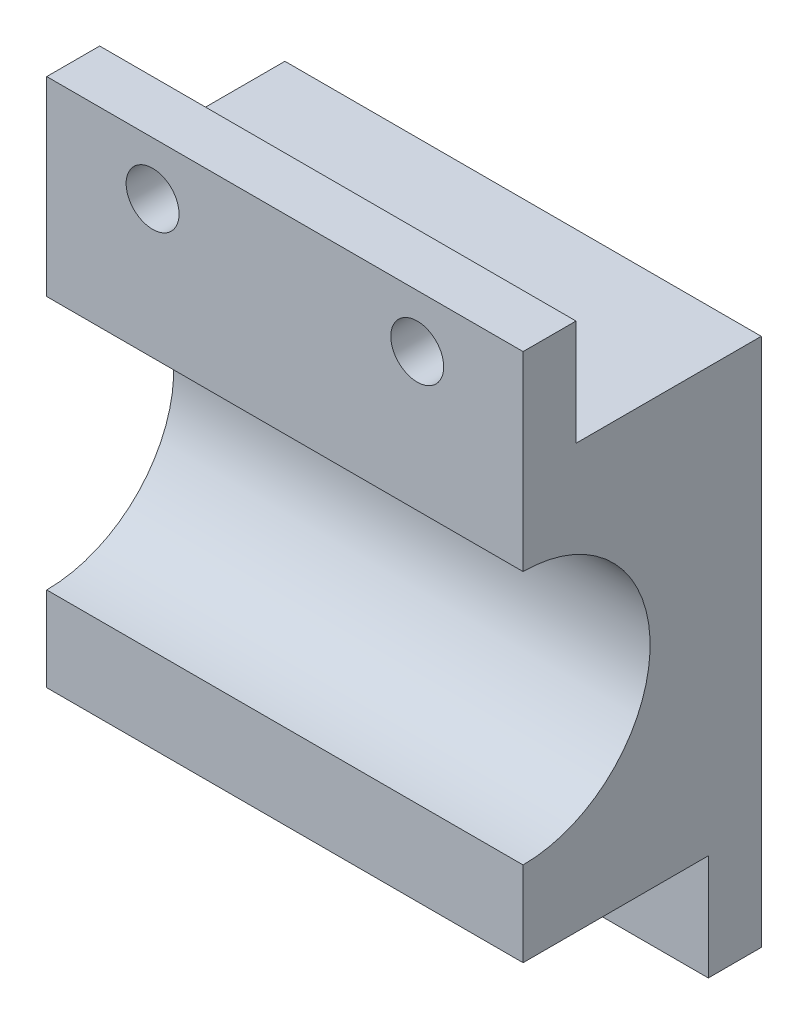
ISO-10303-21;
HEADER;
FILE_DESCRIPTION(('STEP AP214'),'2;1');
FILE_NAME('part.step','',(''),(''),'','','');
FILE_SCHEMA(('AUTOMOTIVE_DESIGN { 1 0 10303 214 1 1 1 1 }'));
ENDSEC;
DATA;
#1=APPLICATION_CONTEXT('core data for automotive mechanical design processes');
#2=APPLICATION_PROTOCOL_DEFINITION('international standard','automotive_design',2000,#1);
#3=PRODUCT_CONTEXT('',#1,'mechanical');
#4=PRODUCT('Part','Part','',(#3));
#5=PRODUCT_RELATED_PRODUCT_CATEGORY('part','',(#4));
#6=PRODUCT_DEFINITION_FORMATION('','',#4);
#7=PRODUCT_DEFINITION_CONTEXT('part definition',#1,'design');
#8=PRODUCT_DEFINITION('design','',#6,#7);
#9=PRODUCT_DEFINITION_SHAPE('','',#8);
#10=(LENGTH_UNIT() NAMED_UNIT(*) SI_UNIT(.MILLI.,.METRE.));
#11=(NAMED_UNIT(*) PLANE_ANGLE_UNIT() SI_UNIT($,.RADIAN.));
#12=(NAMED_UNIT(*) SI_UNIT($,.STERADIAN.) SOLID_ANGLE_UNIT());
#13=UNCERTAINTY_MEASURE_WITH_UNIT(LENGTH_MEASURE(1.E-05),#10,'distance_accuracy_value','');
#14=(GEOMETRIC_REPRESENTATION_CONTEXT(3) GLOBAL_UNCERTAINTY_ASSIGNED_CONTEXT((#13)) GLOBAL_UNIT_ASSIGNED_CONTEXT((#10,
#11,#12)) REPRESENTATION_CONTEXT('',''));
#15=CARTESIAN_POINT('',(0.,0.,0.));
#16=DIRECTION('',(0.,0.,1.));
#17=DIRECTION('',(1.,0.,0.));
#18=AXIS2_PLACEMENT_3D('',#15,#16,#17);
#19=CARTESIAN_POINT('',(45.,-18.,0.));
#20=DIRECTION('',(0.,0.,-1.));
#21=DIRECTION('',(-1.,0.,0.));
#22=AXIS2_PLACEMENT_3D('',#19,#20,#21);
#23=PLANE('',#22);
#24=CARTESIAN_POINT('',(35.,-5.,0.));
#25=DIRECTION('',(0.,0.,-1.));
#26=DIRECTION('',(0.,-1.,0.));
#27=AXIS2_PLACEMENT_3D('',#24,#25,#26);
#28=CIRCLE('',#27,2.5);
#29=CARTESIAN_POINT('',(35.,-2.5,0.));
#30=VERTEX_POINT('',#29);
#31=EDGE_CURVE('E194',#30,#30,#28,.T.);
#32=ORIENTED_EDGE('',*,*,#31,.T.);
#33=EDGE_LOOP('',(#32));
#34=FACE_BOUND('',#33,.T.);
#35=CARTESIAN_POINT('',(10.,-4.99999999999999,0.));
#36=DIRECTION('',(0.,0.,-1.));
#37=DIRECTION('',(0.,1.,0.));
#38=AXIS2_PLACEMENT_3D('',#35,#36,#37);
#39=CIRCLE('',#38,2.5);
#40=CARTESIAN_POINT('',(10.,-2.49999999999999,0.));
#41=VERTEX_POINT('',#40);
#42=EDGE_CURVE('E183',#41,#41,#39,.T.);
#43=ORIENTED_EDGE('',*,*,#42,.T.);
#44=EDGE_LOOP('',(#43));
#45=FACE_BOUND('',#44,.T.);
#46=DIRECTION('',(0.,-1.,0.));
#47=VECTOR('',#46,1.);
#48=CARTESIAN_POINT('',(0.,-18.,0.));
#49=LINE('',#48,#47);
#50=CARTESIAN_POINT('',(0.,0.,0.));
#51=VERTEX_POINT('',#50);
#52=CARTESIAN_POINT('',(0.,-18.,0.));
#53=VERTEX_POINT('',#52);
#54=EDGE_CURVE('E145',#51,#53,#49,.T.);
#55=ORIENTED_EDGE('',*,*,#54,.T.);
#56=DIRECTION('',(-1.,0.,0.));
#57=VECTOR('',#56,1.);
#58=CARTESIAN_POINT('',(45.,-18.,0.));
#59=LINE('',#58,#57);
#60=CARTESIAN_POINT('',(45.,-18.,0.));
#61=VERTEX_POINT('',#60);
#62=EDGE_CURVE('E11',#61,#53,#59,.T.);
#63=ORIENTED_EDGE('',*,*,#62,.F.);
#64=DIRECTION('',(0.,-1.,0.));
#65=VECTOR('',#64,1.);
#66=CARTESIAN_POINT('',(45.,-18.,0.));
#67=LINE('',#66,#65);
#68=CARTESIAN_POINT('',(45.,0.,0.));
#69=VERTEX_POINT('',#68);
#70=EDGE_CURVE('E164',#69,#61,#67,.T.);
#71=ORIENTED_EDGE('',*,*,#70,.F.);
#72=DIRECTION('',(-1.,0.,0.));
#73=VECTOR('',#72,1.);
#74=CARTESIAN_POINT('',(45.,0.,0.));
#75=LINE('',#74,#73);
#76=EDGE_CURVE('E141',#69,#51,#75,.T.);
#77=ORIENTED_EDGE('',*,*,#76,.T.);
#78=EDGE_LOOP('',(#55,#63,#71,#77));
#79=FACE_BOUND('',#78,.T.);
#80=ADVANCED_FACE('F35',(#34,#45,#79),#23,.F.);
#81=CARTESIAN_POINT('',(45.,-30.,0.));
#82=DIRECTION('',(-1.,0.,0.));
#83=DIRECTION('',(0.,0.,1.));
#84=AXIS2_PLACEMENT_3D('',#81,#82,#83);
#85=CYLINDRICAL_SURFACE('',#84,12.);
#86=CARTESIAN_POINT('',(0.,-30.,0.));
#87=DIRECTION('',(-1.,0.,0.));
#88=DIRECTION('',(0.,0.,-1.));
#89=AXIS2_PLACEMENT_3D('',#86,#87,#88);
#90=CIRCLE('',#89,12.);
#91=CARTESIAN_POINT('',(0.,-42.,0.));
#92=VERTEX_POINT('',#91);
#93=EDGE_CURVE('E148',#53,#92,#90,.T.);
#94=ORIENTED_EDGE('',*,*,#93,.T.);
#95=DIRECTION('',(-1.,0.,0.));
#96=VECTOR('',#95,1.);
#97=CARTESIAN_POINT('',(45.,-42.,0.));
#98=LINE('',#97,#96);
#99=CARTESIAN_POINT('',(45.,-42.,0.));
#100=VERTEX_POINT('',#99);
#101=EDGE_CURVE('E44',#100,#92,#98,.T.);
#102=ORIENTED_EDGE('',*,*,#101,.F.);
#103=CARTESIAN_POINT('',(45.,-30.,0.));
#104=DIRECTION('',(-1.,0.,0.));
#105=DIRECTION('',(0.,0.,-1.));
#106=AXIS2_PLACEMENT_3D('',#103,#104,#105);
#107=CIRCLE('',#106,12.);
#108=EDGE_CURVE('E102',#61,#100,#107,.T.);
#109=ORIENTED_EDGE('',*,*,#108,.F.);
#110=ORIENTED_EDGE('',*,*,#62,.T.);
#111=EDGE_LOOP('',(#94,#102,#109,#110));
#112=FACE_BOUND('',#111,.T.);
#113=ADVANCED_FACE('F243',(#112),#85,.F.);
#114=CARTESIAN_POINT('',(45.,-50.,0.));
#115=DIRECTION('',(0.,0.,-1.));
#116=DIRECTION('',(-1.,0.,0.));
#117=AXIS2_PLACEMENT_3D('',#114,#115,#116);
#118=PLANE('',#117);
#119=DIRECTION('',(0.,-1.,0.));
#120=VECTOR('',#119,1.);
#121=CARTESIAN_POINT('',(0.,-50.,0.));
#122=LINE('',#121,#120);
#123=CARTESIAN_POINT('',(0.,-50.,0.));
#124=VERTEX_POINT('',#123);
#125=EDGE_CURVE('E151',#92,#124,#122,.T.);
#126=ORIENTED_EDGE('',*,*,#125,.T.);
#127=DIRECTION('',(-1.,0.,0.));
#128=VECTOR('',#127,1.);
#129=CARTESIAN_POINT('',(45.,-50.,0.));
#130=LINE('',#129,#128);
#131=CARTESIAN_POINT('',(45.,-50.,0.));
#132=VERTEX_POINT('',#131);
#133=EDGE_CURVE('E177',#132,#124,#130,.T.);
#134=ORIENTED_EDGE('',*,*,#133,.F.);
#135=DIRECTION('',(0.,-1.,0.));
#136=VECTOR('',#135,1.);
#137=CARTESIAN_POINT('',(45.,-50.,0.));
#138=LINE('',#137,#136);
#139=EDGE_CURVE('E207',#100,#132,#138,.T.);
#140=ORIENTED_EDGE('',*,*,#139,.F.);
#141=ORIENTED_EDGE('',*,*,#101,.T.);
#142=EDGE_LOOP('',(#126,#134,#140,#141));
#143=FACE_BOUND('',#142,.T.);
#144=ADVANCED_FACE('F248',(#143),#118,.F.);
#145=CARTESIAN_POINT('',(45.,-50.,-17.5));
#146=DIRECTION('',(0.,1.,0.));
#147=DIRECTION('',(0.,0.,1.));
#148=AXIS2_PLACEMENT_3D('',#145,#146,#147);
#149=PLANE('',#148);
#150=DIRECTION('',(0.,0.,-1.));
#151=VECTOR('',#150,1.);
#152=CARTESIAN_POINT('',(0.,-50.,-17.5));
#153=LINE('',#152,#151);
#154=CARTESIAN_POINT('',(0.,-50.,-17.5));
#155=VERTEX_POINT('',#154);
#156=EDGE_CURVE('E153',#124,#155,#153,.T.);
#157=ORIENTED_EDGE('',*,*,#156,.T.);
#158=DIRECTION('',(-1.,0.,0.));
#159=VECTOR('',#158,1.);
#160=CARTESIAN_POINT('',(45.,-50.,-17.5));
#161=LINE('',#160,#159);
#162=CARTESIAN_POINT('',(45.,-50.,-17.5));
#163=VERTEX_POINT('',#162);
#164=EDGE_CURVE('E174',#163,#155,#161,.T.);
#165=ORIENTED_EDGE('',*,*,#164,.F.);
#166=DIRECTION('',(0.,0.,-1.));
#167=VECTOR('',#166,1.);
#168=CARTESIAN_POINT('',(45.,-50.,-17.5));
#169=LINE('',#168,#167);
#170=EDGE_CURVE('E209',#132,#163,#169,.T.);
#171=ORIENTED_EDGE('',*,*,#170,.F.);
#172=ORIENTED_EDGE('',*,*,#133,.T.);
#173=EDGE_LOOP('',(#157,#165,#171,#172));
#174=FACE_BOUND('',#173,.T.);
#175=ADVANCED_FACE('F345',(#174),#149,.F.);
#176=CARTESIAN_POINT('',(45.,-60.,-17.5));
#177=DIRECTION('',(0.,0.,-1.));
#178=DIRECTION('',(0.,1.,0.));
#179=AXIS2_PLACEMENT_3D('',#176,#177,#178);
#180=PLANE('',#179);
#181=CARTESIAN_POINT('',(10.,-55.,-17.5));
#182=DIRECTION('',(0.,0.,-1.));
#183=DIRECTION('',(0.,1.,0.));
#184=AXIS2_PLACEMENT_3D('',#181,#182,#183);
#185=CIRCLE('',#184,2.5);
#186=CARTESIAN_POINT('',(10.,-52.5,-17.5));
#187=VERTEX_POINT('',#186);
#188=EDGE_CURVE('E187',#187,#187,#185,.T.);
#189=ORIENTED_EDGE('',*,*,#188,.T.);
#190=EDGE_LOOP('',(#189));
#191=FACE_BOUND('',#190,.T.);
#192=CARTESIAN_POINT('',(35.,-55.,-17.5));
#193=DIRECTION('',(0.,0.,-1.));
#194=DIRECTION('',(0.,1.,0.));
#195=AXIS2_PLACEMENT_3D('',#192,#193,#194);
#196=CIRCLE('',#195,2.5);
#197=CARTESIAN_POINT('',(35.,-52.5,-17.5));
#198=VERTEX_POINT('',#197);
#199=EDGE_CURVE('E149',#198,#198,#196,.T.);
#200=ORIENTED_EDGE('',*,*,#199,.T.);
#201=EDGE_LOOP('',(#200));
#202=FACE_BOUND('',#201,.T.);
#203=DIRECTION('',(0.,-1.,0.));
#204=VECTOR('',#203,1.);
#205=CARTESIAN_POINT('',(0.,-60.,-17.5));
#206=LINE('',#205,#204);
#207=CARTESIAN_POINT('',(0.,-60.,-17.5));
#208=VERTEX_POINT('',#207);
#209=EDGE_CURVE('E155',#155,#208,#206,.T.);
#210=ORIENTED_EDGE('',*,*,#209,.T.);
#211=DIRECTION('',(-1.,0.,0.));
#212=VECTOR('',#211,1.);
#213=CARTESIAN_POINT('',(45.,-60.,-17.5));
#214=LINE('',#213,#212);
#215=CARTESIAN_POINT('',(45.,-60.,-17.5));
#216=VERTEX_POINT('',#215);
#217=EDGE_CURVE('E171',#216,#208,#214,.T.);
#218=ORIENTED_EDGE('',*,*,#217,.F.);
#219=DIRECTION('',(0.,-1.,0.));
#220=VECTOR('',#219,1.);
#221=CARTESIAN_POINT('',(45.,-60.,-17.5));
#222=LINE('',#221,#220);
#223=EDGE_CURVE('E211',#163,#216,#222,.T.);
#224=ORIENTED_EDGE('',*,*,#223,.F.);
#225=ORIENTED_EDGE('',*,*,#164,.T.);
#226=EDGE_LOOP('',(#210,#218,#224,#225));
#227=FACE_BOUND('',#226,.T.);
#228=ADVANCED_FACE('F337',(#191,#202,#227),#180,.F.);
#229=CARTESIAN_POINT('',(45.,-60.,-22.5));
#230=DIRECTION('',(0.,1.,0.));
#231=DIRECTION('',(0.,0.,1.));
#232=AXIS2_PLACEMENT_3D('',#229,#230,#231);
#233=PLANE('',#232);
#234=DIRECTION('',(0.,0.,-1.));
#235=VECTOR('',#234,1.);
#236=CARTESIAN_POINT('',(0.,-60.,-22.5));
#237=LINE('',#236,#235);
#238=CARTESIAN_POINT('',(0.,-60.,-22.5));
#239=VERTEX_POINT('',#238);
#240=EDGE_CURVE('E157',#208,#239,#237,.T.);
#241=ORIENTED_EDGE('',*,*,#240,.T.);
#242=DIRECTION('',(-1.,0.,0.));
#243=VECTOR('',#242,1.);
#244=CARTESIAN_POINT('',(45.,-60.,-22.5));
#245=LINE('',#244,#243);
#246=CARTESIAN_POINT('',(45.,-60.,-22.5));
#247=VERTEX_POINT('',#246);
#248=EDGE_CURVE('E168',#247,#239,#245,.T.);
#249=ORIENTED_EDGE('',*,*,#248,.F.);
#250=DIRECTION('',(0.,0.,-1.));
#251=VECTOR('',#250,1.);
#252=CARTESIAN_POINT('',(45.,-60.,-22.5));
#253=LINE('',#252,#251);
#254=EDGE_CURVE('E213',#216,#247,#253,.T.);
#255=ORIENTED_EDGE('',*,*,#254,.F.);
#256=ORIENTED_EDGE('',*,*,#217,.T.);
#257=EDGE_LOOP('',(#241,#249,#255,#256));
#258=FACE_BOUND('',#257,.T.);
#259=ADVANCED_FACE('F219',(#258),#233,.F.);
#260=CARTESIAN_POINT('',(45.,-10.,-22.5));
#261=DIRECTION('',(0.,0.,1.));
#262=DIRECTION('',(0.,-1.,0.));
#263=AXIS2_PLACEMENT_3D('',#260,#261,#262);
#264=PLANE('',#263);
#265=CARTESIAN_POINT('',(10.,-55.,-22.5));
#266=DIRECTION('',(0.,0.,-1.));
#267=DIRECTION('',(0.,1.,0.));
#268=AXIS2_PLACEMENT_3D('',#265,#266,#267);
#269=CIRCLE('',#268,2.5);
#270=CARTESIAN_POINT('',(10.,-52.5,-22.5));
#271=VERTEX_POINT('',#270);
#272=EDGE_CURVE('E189',#271,#271,#269,.T.);
#273=ORIENTED_EDGE('',*,*,#272,.F.);
#274=EDGE_LOOP('',(#273));
#275=FACE_BOUND('',#274,.T.);
#276=CARTESIAN_POINT('',(35.,-55.,-22.5));
#277=DIRECTION('',(0.,0.,-1.));
#278=DIRECTION('',(0.,-1.,0.));
#279=AXIS2_PLACEMENT_3D('',#276,#277,#278);
#280=CIRCLE('',#279,2.5);
#281=CARTESIAN_POINT('',(35.,-52.5,-22.5));
#282=VERTEX_POINT('',#281);
#283=EDGE_CURVE('E200',#282,#282,#280,.T.);
#284=ORIENTED_EDGE('',*,*,#283,.F.);
#285=EDGE_LOOP('',(#284));
#286=FACE_BOUND('',#285,.T.);
#287=DIRECTION('',(0.,1.,0.));
#288=VECTOR('',#287,1.);
#289=CARTESIAN_POINT('',(0.,-10.,-22.5));
#290=LINE('',#289,#288);
#291=CARTESIAN_POINT('',(0.,-10.,-22.5));
#292=VERTEX_POINT('',#291);
#293=EDGE_CURVE('E159',#239,#292,#290,.T.);
#294=ORIENTED_EDGE('',*,*,#293,.T.);
#295=DIRECTION('',(-1.,0.,0.));
#296=VECTOR('',#295,1.);
#297=CARTESIAN_POINT('',(45.,-10.,-22.5));
#298=LINE('',#297,#296);
#299=CARTESIAN_POINT('',(45.,-10.,-22.5));
#300=VERTEX_POINT('',#299);
#301=EDGE_CURVE('E136',#300,#292,#298,.T.);
#302=ORIENTED_EDGE('',*,*,#301,.F.);
#303=DIRECTION('',(0.,1.,0.));
#304=VECTOR('',#303,1.);
#305=CARTESIAN_POINT('',(45.,-10.,-22.5));
#306=LINE('',#305,#304);
#307=EDGE_CURVE('E127',#247,#300,#306,.T.);
#308=ORIENTED_EDGE('',*,*,#307,.F.);
#309=ORIENTED_EDGE('',*,*,#248,.T.);
#310=EDGE_LOOP('',(#294,#302,#308,#309));
#311=FACE_BOUND('',#310,.T.);
#312=ADVANCED_FACE('F223',(#275,#286,#311),#264,.F.);
#313=CARTESIAN_POINT('',(45.,-10.,-5.));
#314=DIRECTION('',(0.,-1.,0.));
#315=DIRECTION('',(0.,0.,-1.));
#316=AXIS2_PLACEMENT_3D('',#313,#314,#315);
#317=PLANE('',#316);
#318=DIRECTION('',(0.,0.,1.));
#319=VECTOR('',#318,1.);
#320=CARTESIAN_POINT('',(0.,-10.,-5.));
#321=LINE('',#320,#319);
#322=CARTESIAN_POINT('',(0.,-10.,-5.));
#323=VERTEX_POINT('',#322);
#324=EDGE_CURVE('E135',#292,#323,#321,.T.);
#325=ORIENTED_EDGE('',*,*,#324,.T.);
#326=DIRECTION('',(-1.,0.,0.));
#327=VECTOR('',#326,1.);
#328=CARTESIAN_POINT('',(45.,-10.,-5.));
#329=LINE('',#328,#327);
#330=CARTESIAN_POINT('',(45.,-10.,-5.));
#331=VERTEX_POINT('',#330);
#332=EDGE_CURVE('E132',#331,#323,#329,.T.);
#333=ORIENTED_EDGE('',*,*,#332,.F.);
#334=DIRECTION('',(0.,0.,1.));
#335=VECTOR('',#334,1.);
#336=CARTESIAN_POINT('',(45.,-10.,-5.));
#337=LINE('',#336,#335);
#338=EDGE_CURVE('E121',#300,#331,#337,.T.);
#339=ORIENTED_EDGE('',*,*,#338,.F.);
#340=ORIENTED_EDGE('',*,*,#301,.T.);
#341=EDGE_LOOP('',(#325,#333,#339,#340));
#342=FACE_BOUND('',#341,.T.);
#343=ADVANCED_FACE('F133',(#342),#317,.F.);
#344=CARTESIAN_POINT('',(45.,0.,-5.));
#345=DIRECTION('',(0.,0.,1.));
#346=DIRECTION('',(0.,-1.,0.));
#347=AXIS2_PLACEMENT_3D('',#344,#345,#346);
#348=PLANE('',#347);
#349=CARTESIAN_POINT('',(35.,-5.,-5.));
#350=DIRECTION('',(0.,0.,1.));
#351=DIRECTION('',(0.,-1.,0.));
#352=AXIS2_PLACEMENT_3D('',#349,#350,#351);
#353=CIRCLE('',#352,2.5);
#354=CARTESIAN_POINT('',(35.,-2.5,-5.));
#355=VERTEX_POINT('',#354);
#356=EDGE_CURVE('E38',#355,#355,#353,.T.);
#357=ORIENTED_EDGE('',*,*,#356,.T.);
#358=EDGE_LOOP('',(#357));
#359=FACE_BOUND('',#358,.T.);
#360=CARTESIAN_POINT('',(10.,-4.99999999999999,-5.));
#361=DIRECTION('',(0.,0.,1.));
#362=DIRECTION('',(0.,-1.,0.));
#363=AXIS2_PLACEMENT_3D('',#360,#361,#362);
#364=CIRCLE('',#363,2.5);
#365=CARTESIAN_POINT('',(10.,-2.49999999999999,-5.));
#366=VERTEX_POINT('',#365);
#367=EDGE_CURVE('E181',#366,#366,#364,.T.);
#368=ORIENTED_EDGE('',*,*,#367,.T.);
#369=EDGE_LOOP('',(#368));
#370=FACE_BOUND('',#369,.T.);
#371=DIRECTION('',(0.,1.,0.));
#372=VECTOR('',#371,1.);
#373=CARTESIAN_POINT('',(0.,0.,-5.));
#374=LINE('',#373,#372);
#375=CARTESIAN_POINT('',(0.,0.,-5.));
#376=VERTEX_POINT('',#375);
#377=EDGE_CURVE('E88',#323,#376,#374,.T.);
#378=ORIENTED_EDGE('',*,*,#377,.T.);
#379=DIRECTION('',(-1.,0.,0.));
#380=VECTOR('',#379,1.);
#381=CARTESIAN_POINT('',(45.,0.,-5.));
#382=LINE('',#381,#380);
#383=CARTESIAN_POINT('',(45.,0.,-5.));
#384=VERTEX_POINT('',#383);
#385=EDGE_CURVE('E137',#384,#376,#382,.T.);
#386=ORIENTED_EDGE('',*,*,#385,.F.);
#387=DIRECTION('',(0.,1.,0.));
#388=VECTOR('',#387,1.);
#389=CARTESIAN_POINT('',(45.,0.,-5.));
#390=LINE('',#389,#388);
#391=EDGE_CURVE('E125',#331,#384,#390,.T.);
#392=ORIENTED_EDGE('',*,*,#391,.F.);
#393=ORIENTED_EDGE('',*,*,#332,.T.);
#394=EDGE_LOOP('',(#378,#386,#392,#393));
#395=FACE_BOUND('',#394,.T.);
#396=ADVANCED_FACE('F139',(#359,#370,#395),#348,.F.);
#397=CARTESIAN_POINT('',(45.,0.,0.));
#398=DIRECTION('',(0.,-1.,0.));
#399=DIRECTION('',(0.,0.,-1.));
#400=AXIS2_PLACEMENT_3D('',#397,#398,#399);
#401=PLANE('',#400);
#402=DIRECTION('',(0.,0.,1.));
#403=VECTOR('',#402,1.);
#404=CARTESIAN_POINT('',(0.,0.,0.));
#405=LINE('',#404,#403);
#406=EDGE_CURVE('E94',#376,#51,#405,.T.);
#407=ORIENTED_EDGE('',*,*,#406,.T.);
#408=ORIENTED_EDGE('',*,*,#76,.F.);
#409=DIRECTION('',(0.,0.,1.));
#410=VECTOR('',#409,1.);
#411=CARTESIAN_POINT('',(45.,0.,0.));
#412=LINE('',#411,#410);
#413=EDGE_CURVE('E53',#384,#69,#412,.T.);
#414=ORIENTED_EDGE('',*,*,#413,.F.);
#415=ORIENTED_EDGE('',*,*,#385,.T.);
#416=EDGE_LOOP('',(#407,#408,#414,#415));
#417=FACE_BOUND('',#416,.T.);
#418=ADVANCED_FACE('F231',(#417),#401,.F.);
#419=CARTESIAN_POINT('',(45.,-30.,0.));
#420=DIRECTION('',(1.,0.,0.));
#421=DIRECTION('',(0.,0.,-1.));
#422=AXIS2_PLACEMENT_3D('',#419,#420,#421);
#423=PLANE('',#422);
#424=ORIENTED_EDGE('',*,*,#70,.T.);
#425=ORIENTED_EDGE('',*,*,#108,.T.);
#426=ORIENTED_EDGE('',*,*,#139,.T.);
#427=ORIENTED_EDGE('',*,*,#170,.T.);
#428=ORIENTED_EDGE('',*,*,#223,.T.);
#429=ORIENTED_EDGE('',*,*,#254,.T.);
#430=ORIENTED_EDGE('',*,*,#307,.T.);
#431=ORIENTED_EDGE('',*,*,#338,.T.);
#432=ORIENTED_EDGE('',*,*,#391,.T.);
#433=ORIENTED_EDGE('',*,*,#413,.T.);
#434=EDGE_LOOP('',(#424,#425,#426,#427,#428,#429,#430,#431,#432,#433));
#435=FACE_BOUND('',#434,.T.);
#436=ADVANCED_FACE('F123',(#435),#423,.T.);
#437=CARTESIAN_POINT('',(0.,-30.,0.));
#438=DIRECTION('',(1.,0.,0.));
#439=DIRECTION('',(0.,0.,-1.));
#440=AXIS2_PLACEMENT_3D('',#437,#438,#439);
#441=PLANE('',#440);
#442=ORIENTED_EDGE('',*,*,#54,.F.);
#443=ORIENTED_EDGE('',*,*,#406,.F.);
#444=ORIENTED_EDGE('',*,*,#377,.F.);
#445=ORIENTED_EDGE('',*,*,#324,.F.);
#446=ORIENTED_EDGE('',*,*,#293,.F.);
#447=ORIENTED_EDGE('',*,*,#240,.F.);
#448=ORIENTED_EDGE('',*,*,#209,.F.);
#449=ORIENTED_EDGE('',*,*,#156,.F.);
#450=ORIENTED_EDGE('',*,*,#125,.F.);
#451=ORIENTED_EDGE('',*,*,#93,.F.);
#452=EDGE_LOOP('',(#442,#443,#444,#445,#446,#447,#448,#449,#450,#451));
#453=FACE_BOUND('',#452,.T.);
#454=ADVANCED_FACE('F226',(#453),#441,.F.);
#455=CARTESIAN_POINT('',(35.,-55.,0.));
#456=DIRECTION('',(0.,0.,-1.));
#457=DIRECTION('',(0.,1.,0.));
#458=AXIS2_PLACEMENT_3D('',#455,#456,#457);
#459=CYLINDRICAL_SURFACE('',#458,2.5);
#460=CARTESIAN_POINT('',(35.,-52.5,-22.5));
#461=CARTESIAN_POINT('',(35.,-52.5,-22.4479166666667));
#462=CARTESIAN_POINT('',(35.,-52.5,-22.3958333333333));
#463=CARTESIAN_POINT('',(35.,-52.5,-22.2916666666667));
#464=CARTESIAN_POINT('',(35.,-52.5,-22.2395833333333));
#465=CARTESIAN_POINT('',(35.,-52.5,-22.1354166666667));
#466=CARTESIAN_POINT('',(35.,-52.5,-22.0833333333333));
#467=CARTESIAN_POINT('',(35.,-52.5,-21.9791666666667));
#468=CARTESIAN_POINT('',(35.,-52.5,-21.9270833333333));
#469=CARTESIAN_POINT('',(35.,-52.5,-21.8229166666667));
#470=CARTESIAN_POINT('',(35.,-52.5,-21.7708333333333));
#471=CARTESIAN_POINT('',(35.,-52.5,-21.6666666666667));
#472=CARTESIAN_POINT('',(35.,-52.5,-21.6145833333333));
#473=CARTESIAN_POINT('',(35.,-52.5,-21.5104166666667));
#474=CARTESIAN_POINT('',(35.,-52.5,-21.4583333333333));
#475=CARTESIAN_POINT('',(35.,-52.5,-21.3541666666667));
#476=CARTESIAN_POINT('',(35.,-52.5,-21.3020833333333));
#477=CARTESIAN_POINT('',(35.,-52.5,-21.1979166666667));
#478=CARTESIAN_POINT('',(35.,-52.5,-21.1458333333333));
#479=CARTESIAN_POINT('',(35.,-52.5,-21.0416666666667));
#480=CARTESIAN_POINT('',(35.,-52.5,-20.9895833333333));
#481=CARTESIAN_POINT('',(35.,-52.5,-20.8854166666667));
#482=CARTESIAN_POINT('',(35.,-52.5,-20.8333333333333));
#483=CARTESIAN_POINT('',(35.,-52.5,-20.7291666666667));
#484=CARTESIAN_POINT('',(35.,-52.5,-20.6770833333333));
#485=CARTESIAN_POINT('',(35.,-52.5,-20.5729166666667));
#486=CARTESIAN_POINT('',(35.,-52.5,-20.5208333333333));
#487=CARTESIAN_POINT('',(35.,-52.5,-20.4166666666667));
#488=CARTESIAN_POINT('',(35.,-52.5,-20.3645833333333));
#489=CARTESIAN_POINT('',(35.,-52.5,-20.2604166666667));
#490=CARTESIAN_POINT('',(35.,-52.5,-20.2083333333333));
#491=CARTESIAN_POINT('',(35.,-52.5,-20.1041666666667));
#492=CARTESIAN_POINT('',(35.,-52.5,-20.0520833333333));
#493=CARTESIAN_POINT('',(35.,-52.5,-19.9479166666667));
#494=CARTESIAN_POINT('',(35.,-52.5,-19.8958333333333));
#495=CARTESIAN_POINT('',(35.,-52.5,-19.7916666666667));
#496=CARTESIAN_POINT('',(35.,-52.5,-19.7395833333333));
#497=CARTESIAN_POINT('',(35.,-52.5,-19.6354166666667));
#498=CARTESIAN_POINT('',(35.,-52.5,-19.5833333333333));
#499=CARTESIAN_POINT('',(35.,-52.5,-19.4791666666667));
#500=CARTESIAN_POINT('',(35.,-52.5,-19.4270833333333));
#501=CARTESIAN_POINT('',(35.,-52.5,-19.3229166666667));
#502=CARTESIAN_POINT('',(35.,-52.5,-19.2708333333333));
#503=CARTESIAN_POINT('',(35.,-52.5,-19.1666666666667));
#504=CARTESIAN_POINT('',(35.,-52.5,-19.1145833333333));
#505=CARTESIAN_POINT('',(35.,-52.5,-19.0104166666667));
#506=CARTESIAN_POINT('',(35.,-52.5,-18.9583333333333));
#507=CARTESIAN_POINT('',(35.,-52.5,-18.8541666666667));
#508=CARTESIAN_POINT('',(35.,-52.5,-18.8020833333333));
#509=CARTESIAN_POINT('',(35.,-52.5,-18.6979166666667));
#510=CARTESIAN_POINT('',(35.,-52.5,-18.6458333333333));
#511=CARTESIAN_POINT('',(35.,-52.5,-18.5416666666667));
#512=CARTESIAN_POINT('',(35.,-52.5,-18.4895833333333));
#513=CARTESIAN_POINT('',(35.,-52.5,-18.3854166666667));
#514=CARTESIAN_POINT('',(35.,-52.5,-18.3333333333333));
#515=CARTESIAN_POINT('',(35.,-52.5,-18.2291666666667));
#516=CARTESIAN_POINT('',(35.,-52.5,-18.1770833333333));
#517=CARTESIAN_POINT('',(35.,-52.5,-18.0729166666667));
#518=CARTESIAN_POINT('',(35.,-52.5,-18.0208333333333));
#519=CARTESIAN_POINT('',(35.,-52.5,-17.9166666666667));
#520=CARTESIAN_POINT('',(35.,-52.5,-17.8645833333333));
#521=CARTESIAN_POINT('',(35.,-52.5,-17.7604166666667));
#522=CARTESIAN_POINT('',(35.,-52.5,-17.7083333333333));
#523=CARTESIAN_POINT('',(35.,-52.5,-17.6041666666667));
#524=CARTESIAN_POINT('',(35.,-52.5,-17.5520833333333));
#525=CARTESIAN_POINT('',(35.,-52.5,-17.5));
#526=B_SPLINE_CURVE_WITH_KNOTS('',3,(#460,#461,#462,#463,#464,#465,#466,#467,#468,#469,#470,
#471,#472,#473,#474,#475,#476,#477,#478,#479,#480,#481,#482,#483,#484,#485,#486,#487,#488,#489,
#490,#491,#492,#493,#494,#495,#496,#497,#498,#499,#500,#501,#502,#503,#504,#505,#506,#507,#508,
#509,#510,#511,#512,#513,#514,#515,#516,#517,#518,#519,#520,#521,#522,#523,#524,#525),
.UNSPECIFIED.,.F.,.F.,(4,2,2,2,2,2,2,2,2,2,2,2,2,2,2,2,2,2,2,2,2,2,2,2,2,2,2,2,2,2,2,2,4),(0.,
0.15625,0.3125,0.468749999999997,0.624999999999997,0.781249999999997,0.937499999999997,1.09375,
1.24999999999999,1.40624999999999,1.56249999999999,1.71874999999999,1.87499999999999,
2.03124999999999,2.18749999999999,2.34374999999999,2.49999999999999,2.65624999999999,
2.81249999999999,2.96874999999999,3.12499999999999,3.28124999999999,3.43749999999999,
3.59374999999999,3.74999999999999,3.90624999999999,4.06249999999999,4.21874999999999,
4.37499999999999,4.53124999999999,4.68749999999998,4.84374999999998,4.99999999999998),.UNSPECIFIED.);
#527=EDGE_CURVE('BSEAM265',#282,#198,#526,.T.);
#528=ORIENTED_EDGE('',*,*,#283,.T.);
#529=ORIENTED_EDGE('',*,*,#199,.F.);
#530=ORIENTED_EDGE('',*,*,#527,.T.);
#531=ORIENTED_EDGE('',*,*,#527,.F.);
#532=EDGE_LOOP('',(#528,#530,#529,#531));
#533=FACE_BOUND('',#532,.T.);
#534=ADVANCED_FACE('F265',(#533),#459,.F.);
#535=CARTESIAN_POINT('',(10.,-4.99999999999999,0.));
#536=DIRECTION('',(0.,0.,-1.));
#537=DIRECTION('',(0.,1.,0.));
#538=AXIS2_PLACEMENT_3D('',#535,#536,#537);
#539=CYLINDRICAL_SURFACE('',#538,2.5);
#540=CARTESIAN_POINT('',(10.,-2.49999999999999,0.));
#541=CARTESIAN_POINT('',(10.,-2.49999999999999,-0.0520833333333337));
#542=CARTESIAN_POINT('',(10.,-2.49999999999999,-0.104166666666667));
#543=CARTESIAN_POINT('',(10.,-2.49999999999999,-0.208333333333334));
#544=CARTESIAN_POINT('',(10.,-2.49999999999999,-0.260416666666667));
#545=CARTESIAN_POINT('',(10.,-2.49999999999999,-0.364583333333334));
#546=CARTESIAN_POINT('',(10.,-2.49999999999999,-0.416666666666667));
#547=CARTESIAN_POINT('',(10.,-2.49999999999999,-0.520833333333334));
#548=CARTESIAN_POINT('',(10.,-2.49999999999999,-0.572916666666667));
#549=CARTESIAN_POINT('',(10.,-2.49999999999999,-0.677083333333333));
#550=CARTESIAN_POINT('',(10.,-2.49999999999999,-0.729166666666667));
#551=CARTESIAN_POINT('',(10.,-2.49999999999999,-0.833333333333333));
#552=CARTESIAN_POINT('',(10.,-2.49999999999999,-0.885416666666667));
#553=CARTESIAN_POINT('',(10.,-2.49999999999999,-0.989583333333333));
#554=CARTESIAN_POINT('',(10.,-2.49999999999999,-1.04166666666667));
#555=CARTESIAN_POINT('',(10.,-2.49999999999999,-1.14583333333333));
#556=CARTESIAN_POINT('',(10.,-2.49999999999999,-1.19791666666667));
#557=CARTESIAN_POINT('',(10.,-2.49999999999999,-1.30208333333333));
#558=CARTESIAN_POINT('',(10.,-2.49999999999999,-1.35416666666667));
#559=CARTESIAN_POINT('',(10.,-2.49999999999999,-1.45833333333333));
#560=CARTESIAN_POINT('',(10.,-2.49999999999999,-1.51041666666667));
#561=CARTESIAN_POINT('',(10.,-2.49999999999999,-1.61458333333333));
#562=CARTESIAN_POINT('',(10.,-2.49999999999999,-1.66666666666667));
#563=CARTESIAN_POINT('',(10.,-2.49999999999999,-1.77083333333333));
#564=CARTESIAN_POINT('',(10.,-2.49999999999999,-1.82291666666667));
#565=CARTESIAN_POINT('',(10.,-2.49999999999999,-1.92708333333333));
#566=CARTESIAN_POINT('',(10.,-2.49999999999999,-1.97916666666667));
#567=CARTESIAN_POINT('',(10.,-2.49999999999999,-2.08333333333333));
#568=CARTESIAN_POINT('',(10.,-2.49999999999999,-2.13541666666667));
#569=CARTESIAN_POINT('',(10.,-2.49999999999999,-2.23958333333333));
#570=CARTESIAN_POINT('',(10.,-2.49999999999999,-2.29166666666667));
#571=CARTESIAN_POINT('',(10.,-2.49999999999999,-2.39583333333333));
#572=CARTESIAN_POINT('',(10.,-2.49999999999999,-2.44791666666667));
#573=CARTESIAN_POINT('',(10.,-2.49999999999999,-2.55208333333333));
#574=CARTESIAN_POINT('',(10.,-2.49999999999999,-2.60416666666667));
#575=CARTESIAN_POINT('',(10.,-2.49999999999999,-2.70833333333333));
#576=CARTESIAN_POINT('',(10.,-2.49999999999999,-2.76041666666667));
#577=CARTESIAN_POINT('',(10.,-2.49999999999999,-2.86458333333333));
#578=CARTESIAN_POINT('',(10.,-2.49999999999999,-2.91666666666667));
#579=CARTESIAN_POINT('',(10.,-2.49999999999999,-3.02083333333333));
#580=CARTESIAN_POINT('',(10.,-2.49999999999999,-3.07291666666667));
#581=CARTESIAN_POINT('',(10.,-2.49999999999999,-3.17708333333333));
#582=CARTESIAN_POINT('',(10.,-2.49999999999999,-3.22916666666667));
#583=CARTESIAN_POINT('',(10.,-2.49999999999999,-3.33333333333333));
#584=CARTESIAN_POINT('',(10.,-2.49999999999999,-3.38541666666667));
#585=CARTESIAN_POINT('',(10.,-2.49999999999999,-3.48958333333333));
#586=CARTESIAN_POINT('',(10.,-2.49999999999999,-3.54166666666667));
#587=CARTESIAN_POINT('',(10.,-2.49999999999999,-3.64583333333333));
#588=CARTESIAN_POINT('',(10.,-2.49999999999999,-3.69791666666667));
#589=CARTESIAN_POINT('',(10.,-2.49999999999999,-3.80208333333333));
#590=CARTESIAN_POINT('',(10.,-2.49999999999999,-3.85416666666667));
#591=CARTESIAN_POINT('',(10.,-2.49999999999999,-3.95833333333333));
#592=CARTESIAN_POINT('',(10.,-2.49999999999999,-4.01041666666667));
#593=CARTESIAN_POINT('',(10.,-2.49999999999999,-4.11458333333333));
#594=CARTESIAN_POINT('',(10.,-2.49999999999999,-4.16666666666667));
#595=CARTESIAN_POINT('',(10.,-2.49999999999999,-4.27083333333333));
#596=CARTESIAN_POINT('',(10.,-2.49999999999999,-4.32291666666667));
#597=CARTESIAN_POINT('',(10.,-2.49999999999999,-4.42708333333333));
#598=CARTESIAN_POINT('',(10.,-2.49999999999999,-4.47916666666667));
#599=CARTESIAN_POINT('',(10.,-2.49999999999999,-4.58333333333333));
#600=CARTESIAN_POINT('',(10.,-2.49999999999999,-4.63541666666667));
#601=CARTESIAN_POINT('',(10.,-2.49999999999999,-4.73958333333333));
#602=CARTESIAN_POINT('',(10.,-2.49999999999999,-4.79166666666666));
#603=CARTESIAN_POINT('',(10.,-2.49999999999999,-4.89583333333333));
#604=CARTESIAN_POINT('',(10.,-2.49999999999999,-4.94791666666666));
#605=CARTESIAN_POINT('',(10.,-2.49999999999999,-5.));
#606=B_SPLINE_CURVE_WITH_KNOTS('',3,(#540,#541,#542,#543,#544,#545,#546,#547,#548,#549,#550,
#551,#552,#553,#554,#555,#556,#557,#558,#559,#560,#561,#562,#563,#564,#565,#566,#567,#568,#569,
#570,#571,#572,#573,#574,#575,#576,#577,#578,#579,#580,#581,#582,#583,#584,#585,#586,#587,#588,
#589,#590,#591,#592,#593,#594,#595,#596,#597,#598,#599,#600,#601,#602,#603,#604,#605),
.UNSPECIFIED.,.F.,.F.,(4,2,2,2,2,2,2,2,2,2,2,2,2,2,2,2,2,2,2,2,2,2,2,2,2,2,2,2,2,2,2,2,4),(0.,
0.15625,0.3125,0.46875,0.625,0.78125,0.9375,1.09375,1.25,1.40625,1.5625,1.71875,1.875,2.03125,
2.1875,2.34375,2.5,2.65625,2.8125,2.96875,3.125,3.28125,3.4375,3.59375,3.75,3.90625,4.0625,
4.21875,4.375,4.53125,4.6875,4.84375,5.),.UNSPECIFIED.);
#607=EDGE_CURVE('BSEAM256',#41,#366,#606,.T.);
#608=ORIENTED_EDGE('',*,*,#42,.F.);
#609=ORIENTED_EDGE('',*,*,#367,.F.);
#610=ORIENTED_EDGE('',*,*,#607,.T.);
#611=ORIENTED_EDGE('',*,*,#607,.F.);
#612=EDGE_LOOP('',(#608,#610,#609,#611));
#613=FACE_BOUND('',#612,.T.);
#614=ADVANCED_FACE('F256',(#613),#539,.F.);
#615=CARTESIAN_POINT('',(35.,-5.,0.));
#616=DIRECTION('',(0.,0.,-1.));
#617=DIRECTION('',(0.,1.,0.));
#618=AXIS2_PLACEMENT_3D('',#615,#616,#617);
#619=CYLINDRICAL_SURFACE('',#618,2.5);
#620=CARTESIAN_POINT('',(35.,-2.5,0.));
#621=CARTESIAN_POINT('',(35.,-2.5,-0.0520833333333338));
#622=CARTESIAN_POINT('',(35.,-2.5,-0.104166666666667));
#623=CARTESIAN_POINT('',(35.,-2.5,-0.208333333333334));
#624=CARTESIAN_POINT('',(35.,-2.5,-0.260416666666667));
#625=CARTESIAN_POINT('',(35.,-2.5,-0.364583333333334));
#626=CARTESIAN_POINT('',(35.,-2.5,-0.416666666666667));
#627=CARTESIAN_POINT('',(35.,-2.5,-0.520833333333334));
#628=CARTESIAN_POINT('',(35.,-2.5,-0.572916666666667));
#629=CARTESIAN_POINT('',(35.,-2.5,-0.677083333333334));
#630=CARTESIAN_POINT('',(35.,-2.5,-0.729166666666667));
#631=CARTESIAN_POINT('',(35.,-2.5,-0.833333333333334));
#632=CARTESIAN_POINT('',(35.,-2.5,-0.885416666666667));
#633=CARTESIAN_POINT('',(35.,-2.5,-0.989583333333334));
#634=CARTESIAN_POINT('',(35.,-2.5,-1.04166666666667));
#635=CARTESIAN_POINT('',(35.,-2.5,-1.14583333333333));
#636=CARTESIAN_POINT('',(35.,-2.5,-1.19791666666667));
#637=CARTESIAN_POINT('',(35.,-2.5,-1.30208333333333));
#638=CARTESIAN_POINT('',(35.,-2.5,-1.35416666666667));
#639=CARTESIAN_POINT('',(35.,-2.5,-1.45833333333333));
#640=CARTESIAN_POINT('',(35.,-2.5,-1.51041666666667));
#641=CARTESIAN_POINT('',(35.,-2.5,-1.61458333333333));
#642=CARTESIAN_POINT('',(35.,-2.5,-1.66666666666667));
#643=CARTESIAN_POINT('',(35.,-2.5,-1.77083333333333));
#644=CARTESIAN_POINT('',(35.,-2.5,-1.82291666666667));
#645=CARTESIAN_POINT('',(35.,-2.5,-1.92708333333333));
#646=CARTESIAN_POINT('',(35.,-2.5,-1.97916666666667));
#647=CARTESIAN_POINT('',(35.,-2.5,-2.08333333333333));
#648=CARTESIAN_POINT('',(35.,-2.5,-2.13541666666667));
#649=CARTESIAN_POINT('',(35.,-2.5,-2.23958333333333));
#650=CARTESIAN_POINT('',(35.,-2.5,-2.29166666666667));
#651=CARTESIAN_POINT('',(35.,-2.5,-2.39583333333333));
#652=CARTESIAN_POINT('',(35.,-2.5,-2.44791666666667));
#653=CARTESIAN_POINT('',(35.,-2.5,-2.55208333333333));
#654=CARTESIAN_POINT('',(35.,-2.5,-2.60416666666667));
#655=CARTESIAN_POINT('',(35.,-2.5,-2.70833333333333));
#656=CARTESIAN_POINT('',(35.,-2.5,-2.76041666666667));
#657=CARTESIAN_POINT('',(35.,-2.5,-2.86458333333333));
#658=CARTESIAN_POINT('',(35.,-2.5,-2.91666666666667));
#659=CARTESIAN_POINT('',(35.,-2.5,-3.02083333333333));
#660=CARTESIAN_POINT('',(35.,-2.5,-3.07291666666667));
#661=CARTESIAN_POINT('',(35.,-2.5,-3.17708333333333));
#662=CARTESIAN_POINT('',(35.,-2.5,-3.22916666666667));
#663=CARTESIAN_POINT('',(35.,-2.5,-3.33333333333333));
#664=CARTESIAN_POINT('',(35.,-2.5,-3.38541666666667));
#665=CARTESIAN_POINT('',(35.,-2.5,-3.48958333333333));
#666=CARTESIAN_POINT('',(35.,-2.5,-3.54166666666667));
#667=CARTESIAN_POINT('',(35.,-2.5,-3.64583333333333));
#668=CARTESIAN_POINT('',(35.,-2.5,-3.69791666666667));
#669=CARTESIAN_POINT('',(35.,-2.5,-3.80208333333333));
#670=CARTESIAN_POINT('',(35.,-2.5,-3.85416666666667));
#671=CARTESIAN_POINT('',(35.,-2.5,-3.95833333333333));
#672=CARTESIAN_POINT('',(35.,-2.5,-4.01041666666667));
#673=CARTESIAN_POINT('',(35.,-2.5,-4.11458333333333));
#674=CARTESIAN_POINT('',(35.,-2.5,-4.16666666666667));
#675=CARTESIAN_POINT('',(35.,-2.5,-4.27083333333333));
#676=CARTESIAN_POINT('',(35.,-2.5,-4.32291666666667));
#677=CARTESIAN_POINT('',(35.,-2.5,-4.42708333333333));
#678=CARTESIAN_POINT('',(35.,-2.5,-4.47916666666667));
#679=CARTESIAN_POINT('',(35.,-2.5,-4.58333333333333));
#680=CARTESIAN_POINT('',(35.,-2.5,-4.63541666666667));
#681=CARTESIAN_POINT('',(35.,-2.5,-4.73958333333333));
#682=CARTESIAN_POINT('',(35.,-2.5,-4.79166666666667));
#683=CARTESIAN_POINT('',(35.,-2.5,-4.89583333333333));
#684=CARTESIAN_POINT('',(35.,-2.5,-4.94791666666667));
#685=CARTESIAN_POINT('',(35.,-2.5,-5.));
#686=B_SPLINE_CURVE_WITH_KNOTS('',3,(#620,#621,#622,#623,#624,#625,#626,#627,#628,#629,#630,
#631,#632,#633,#634,#635,#636,#637,#638,#639,#640,#641,#642,#643,#644,#645,#646,#647,#648,#649,
#650,#651,#652,#653,#654,#655,#656,#657,#658,#659,#660,#661,#662,#663,#664,#665,#666,#667,#668,
#669,#670,#671,#672,#673,#674,#675,#676,#677,#678,#679,#680,#681,#682,#683,#684,#685),
.UNSPECIFIED.,.F.,.F.,(4,2,2,2,2,2,2,2,2,2,2,2,2,2,2,2,2,2,2,2,2,2,2,2,2,2,2,2,2,2,2,2,4),(0.,
0.15625,0.3125,0.46875,0.625,0.78125,0.9375,1.09375,1.25,1.40625,1.5625,1.71875,1.875,2.03125,
2.1875,2.34375,2.5,2.65625,2.8125,2.96875,3.125,3.28125,3.4375,3.59375,3.75,3.90625,4.0625,
4.21875,4.375,4.53125,4.6875,4.84375,5.),.UNSPECIFIED.);
#687=EDGE_CURVE('BSEAM252',#30,#355,#686,.T.);
#688=ORIENTED_EDGE('',*,*,#31,.F.);
#689=ORIENTED_EDGE('',*,*,#356,.F.);
#690=ORIENTED_EDGE('',*,*,#687,.T.);
#691=ORIENTED_EDGE('',*,*,#687,.F.);
#692=EDGE_LOOP('',(#688,#690,#689,#691));
#693=FACE_BOUND('',#692,.T.);
#694=ADVANCED_FACE('F252',(#693),#619,.F.);
#695=CARTESIAN_POINT('',(10.,-55.,0.));
#696=DIRECTION('',(0.,0.,-1.));
#697=DIRECTION('',(0.,1.,0.));
#698=AXIS2_PLACEMENT_3D('',#695,#696,#697);
#699=CYLINDRICAL_SURFACE('',#698,2.5);
#700=CARTESIAN_POINT('',(10.,-52.5,-22.5));
#701=CARTESIAN_POINT('',(10.,-52.5,-22.4479166666667));
#702=CARTESIAN_POINT('',(10.,-52.5,-22.3958333333333));
#703=CARTESIAN_POINT('',(10.,-52.5,-22.2916666666667));
#704=CARTESIAN_POINT('',(10.,-52.5,-22.2395833333333));
#705=CARTESIAN_POINT('',(10.,-52.5,-22.1354166666667));
#706=CARTESIAN_POINT('',(10.,-52.5,-22.0833333333333));
#707=CARTESIAN_POINT('',(10.,-52.5,-21.9791666666667));
#708=CARTESIAN_POINT('',(10.,-52.5,-21.9270833333333));
#709=CARTESIAN_POINT('',(10.,-52.5,-21.8229166666667));
#710=CARTESIAN_POINT('',(10.,-52.5,-21.7708333333333));
#711=CARTESIAN_POINT('',(10.,-52.5,-21.6666666666667));
#712=CARTESIAN_POINT('',(10.,-52.5,-21.6145833333333));
#713=CARTESIAN_POINT('',(10.,-52.5,-21.5104166666667));
#714=CARTESIAN_POINT('',(10.,-52.5,-21.4583333333333));
#715=CARTESIAN_POINT('',(10.,-52.5,-21.3541666666667));
#716=CARTESIAN_POINT('',(10.,-52.5,-21.3020833333333));
#717=CARTESIAN_POINT('',(10.,-52.5,-21.1979166666667));
#718=CARTESIAN_POINT('',(10.,-52.5,-21.1458333333333));
#719=CARTESIAN_POINT('',(10.,-52.5,-21.0416666666667));
#720=CARTESIAN_POINT('',(10.,-52.5,-20.9895833333333));
#721=CARTESIAN_POINT('',(10.,-52.5,-20.8854166666667));
#722=CARTESIAN_POINT('',(10.,-52.5,-20.8333333333333));
#723=CARTESIAN_POINT('',(10.,-52.5,-20.7291666666667));
#724=CARTESIAN_POINT('',(10.,-52.5,-20.6770833333333));
#725=CARTESIAN_POINT('',(10.,-52.5,-20.5729166666667));
#726=CARTESIAN_POINT('',(10.,-52.5,-20.5208333333333));
#727=CARTESIAN_POINT('',(10.,-52.5,-20.4166666666667));
#728=CARTESIAN_POINT('',(10.,-52.5,-20.3645833333333));
#729=CARTESIAN_POINT('',(10.,-52.5,-20.2604166666667));
#730=CARTESIAN_POINT('',(10.,-52.5,-20.2083333333333));
#731=CARTESIAN_POINT('',(10.,-52.5,-20.1041666666667));
#732=CARTESIAN_POINT('',(10.,-52.5,-20.0520833333333));
#733=CARTESIAN_POINT('',(10.,-52.5,-19.9479166666667));
#734=CARTESIAN_POINT('',(10.,-52.5,-19.8958333333333));
#735=CARTESIAN_POINT('',(10.,-52.5,-19.7916666666667));
#736=CARTESIAN_POINT('',(10.,-52.5,-19.7395833333333));
#737=CARTESIAN_POINT('',(10.,-52.5,-19.6354166666667));
#738=CARTESIAN_POINT('',(10.,-52.5,-19.5833333333333));
#739=CARTESIAN_POINT('',(10.,-52.5,-19.4791666666667));
#740=CARTESIAN_POINT('',(10.,-52.5,-19.4270833333333));
#741=CARTESIAN_POINT('',(10.,-52.5,-19.3229166666667));
#742=CARTESIAN_POINT('',(10.,-52.5,-19.2708333333333));
#743=CARTESIAN_POINT('',(10.,-52.5,-19.1666666666667));
#744=CARTESIAN_POINT('',(10.,-52.5,-19.1145833333333));
#745=CARTESIAN_POINT('',(10.,-52.5,-19.0104166666667));
#746=CARTESIAN_POINT('',(10.,-52.5,-18.9583333333333));
#747=CARTESIAN_POINT('',(10.,-52.5,-18.8541666666667));
#748=CARTESIAN_POINT('',(10.,-52.5,-18.8020833333333));
#749=CARTESIAN_POINT('',(10.,-52.5,-18.6979166666667));
#750=CARTESIAN_POINT('',(10.,-52.5,-18.6458333333333));
#751=CARTESIAN_POINT('',(10.,-52.5,-18.5416666666667));
#752=CARTESIAN_POINT('',(10.,-52.5,-18.4895833333333));
#753=CARTESIAN_POINT('',(10.,-52.5,-18.3854166666667));
#754=CARTESIAN_POINT('',(10.,-52.5,-18.3333333333333));
#755=CARTESIAN_POINT('',(10.,-52.5,-18.2291666666667));
#756=CARTESIAN_POINT('',(10.,-52.5,-18.1770833333333));
#757=CARTESIAN_POINT('',(10.,-52.5,-18.0729166666667));
#758=CARTESIAN_POINT('',(10.,-52.5,-18.0208333333333));
#759=CARTESIAN_POINT('',(10.,-52.5,-17.9166666666667));
#760=CARTESIAN_POINT('',(10.,-52.5,-17.8645833333333));
#761=CARTESIAN_POINT('',(10.,-52.5,-17.7604166666667));
#762=CARTESIAN_POINT('',(10.,-52.5,-17.7083333333333));
#763=CARTESIAN_POINT('',(10.,-52.5,-17.6041666666667));
#764=CARTESIAN_POINT('',(10.,-52.5,-17.5520833333333));
#765=CARTESIAN_POINT('',(10.,-52.5,-17.5));
#766=B_SPLINE_CURVE_WITH_KNOTS('',3,(#700,#701,#702,#703,#704,#705,#706,#707,#708,#709,#710,
#711,#712,#713,#714,#715,#716,#717,#718,#719,#720,#721,#722,#723,#724,#725,#726,#727,#728,#729,
#730,#731,#732,#733,#734,#735,#736,#737,#738,#739,#740,#741,#742,#743,#744,#745,#746,#747,#748,
#749,#750,#751,#752,#753,#754,#755,#756,#757,#758,#759,#760,#761,#762,#763,#764,#765),
.UNSPECIFIED.,.F.,.F.,(4,2,2,2,2,2,2,2,2,2,2,2,2,2,2,2,2,2,2,2,2,2,2,2,2,2,2,2,2,2,2,2,4),(0.,
0.15625,0.3125,0.468749999999997,0.624999999999997,0.781249999999997,0.937499999999997,1.09375,
1.24999999999999,1.40624999999999,1.56249999999999,1.71874999999999,1.87499999999999,
2.03124999999999,2.18749999999999,2.34374999999999,2.49999999999999,2.65624999999999,
2.81249999999999,2.96874999999999,3.12499999999999,3.28124999999999,3.43749999999999,
3.59374999999999,3.74999999999999,3.90624999999999,4.06249999999999,4.21874999999999,
4.37499999999999,4.53124999999999,4.68749999999998,4.84374999999998,4.99999999999998),.UNSPECIFIED.);
#767=EDGE_CURVE('BSEAM255',#271,#187,#766,.T.);
#768=ORIENTED_EDGE('',*,*,#272,.T.);
#769=ORIENTED_EDGE('',*,*,#188,.F.);
#770=ORIENTED_EDGE('',*,*,#767,.T.);
#771=ORIENTED_EDGE('',*,*,#767,.F.);
#772=EDGE_LOOP('',(#768,#770,#769,#771));
#773=FACE_BOUND('',#772,.T.);
#774=ADVANCED_FACE('F255',(#773),#699,.F.);
#775=CLOSED_SHELL('',(#80,#113,#144,#175,#228,#259,#312,#343,#396,#418,#436,#454,#534,#614,#694,#774));
#776=MANIFOLD_SOLID_BREP('B2',#775);
#777=ADVANCED_BREP_SHAPE_REPRESENTATION('',(#18,#776),#14);
#778=SHAPE_DEFINITION_REPRESENTATION(#9,#777);
ENDSEC;
END-ISO-10303-21;
